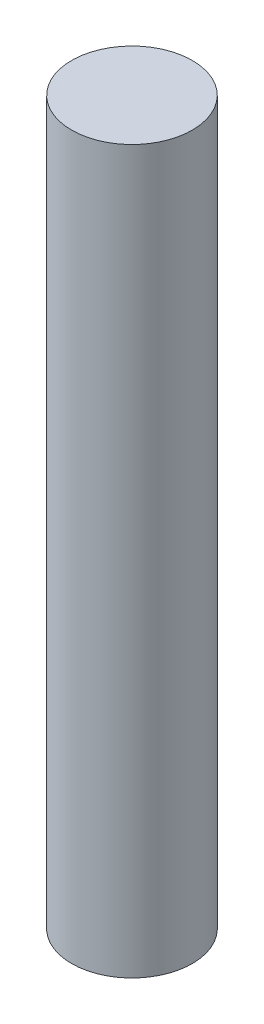
ISO-10303-21;
HEADER;
FILE_DESCRIPTION(('STEP AP214'),'2;1');
FILE_NAME('part.step','',(''),(''),'','','');
FILE_SCHEMA(('AUTOMOTIVE_DESIGN { 1 0 10303 214 1 1 1 1 }'));
ENDSEC;
DATA;
#1=APPLICATION_CONTEXT('core data for automotive mechanical design processes');
#2=APPLICATION_PROTOCOL_DEFINITION('international standard','automotive_design',2000,#1);
#3=PRODUCT_CONTEXT('',#1,'mechanical');
#4=PRODUCT('Part','Part','',(#3));
#5=PRODUCT_RELATED_PRODUCT_CATEGORY('part','',(#4));
#6=PRODUCT_DEFINITION_FORMATION('','',#4);
#7=PRODUCT_DEFINITION_CONTEXT('part definition',#1,'design');
#8=PRODUCT_DEFINITION('design','',#6,#7);
#9=PRODUCT_DEFINITION_SHAPE('','',#8);
#10=(LENGTH_UNIT() NAMED_UNIT(*) SI_UNIT(.MILLI.,.METRE.));
#11=(NAMED_UNIT(*) PLANE_ANGLE_UNIT() SI_UNIT($,.RADIAN.));
#12=(NAMED_UNIT(*) SI_UNIT($,.STERADIAN.) SOLID_ANGLE_UNIT());
#13=UNCERTAINTY_MEASURE_WITH_UNIT(LENGTH_MEASURE(1.E-05),#10,'distance_accuracy_value','');
#14=(GEOMETRIC_REPRESENTATION_CONTEXT(3) GLOBAL_UNCERTAINTY_ASSIGNED_CONTEXT((#13)) GLOBAL_UNIT_ASSIGNED_CONTEXT((#10,
#11,#12)) REPRESENTATION_CONTEXT('',''));
#15=CARTESIAN_POINT('',(0.,0.,0.));
#16=DIRECTION('',(0.,0.,1.));
#17=DIRECTION('',(1.,0.,0.));
#18=AXIS2_PLACEMENT_3D('',#15,#16,#17);
#19=CARTESIAN_POINT('',(0.,24.7,0.));
#20=DIRECTION('',(0.,-1.,0.));
#21=DIRECTION('',(0.,0.,-1.));
#22=AXIS2_PLACEMENT_3D('',#19,#20,#21);
#23=CYLINDRICAL_SURFACE('',#22,2.065);
#24=CARTESIAN_POINT('',(0.,24.7,0.));
#25=DIRECTION('',(0.,1.,0.));
#26=DIRECTION('',(0.,0.,1.));
#27=AXIS2_PLACEMENT_3D('',#24,#25,#26);
#28=CIRCLE('',#27,2.065);
#29=CARTESIAN_POINT('',(0.,24.7,2.065));
#30=VERTEX_POINT('',#29);
#31=EDGE_CURVE('E10',#30,#30,#28,.T.);
#32=ORIENTED_EDGE('',*,*,#31,.F.);
#33=EDGE_LOOP('',(#32));
#34=FACE_BOUND('',#33,.T.);
#35=CARTESIAN_POINT('',(0.,0.,0.));
#36=DIRECTION('',(0.,1.,0.));
#37=DIRECTION('',(0.,0.,1.));
#38=AXIS2_PLACEMENT_3D('',#35,#36,#37);
#39=CIRCLE('',#38,2.065);
#40=CARTESIAN_POINT('',(0.,0.,2.065));
#41=VERTEX_POINT('',#40);
#42=EDGE_CURVE('E37',#41,#41,#39,.T.);
#43=ORIENTED_EDGE('',*,*,#42,.T.);
#44=EDGE_LOOP('',(#43));
#45=FACE_BOUND('',#44,.T.);
#46=ADVANCED_FACE('F34',(#34,#45),#23,.T.);
#47=CARTESIAN_POINT('',(0.,24.7,0.));
#48=DIRECTION('',(0.,1.,0.));
#49=DIRECTION('',(0.,0.,1.));
#50=AXIS2_PLACEMENT_3D('',#47,#48,#49);
#51=PLANE('',#50);
#52=ORIENTED_EDGE('',*,*,#31,.T.);
#53=EDGE_LOOP('',(#52));
#54=FACE_BOUND('',#53,.T.);
#55=ADVANCED_FACE('F49',(#54),#51,.T.);
#56=CARTESIAN_POINT('',(0.,0.,0.));
#57=DIRECTION('',(0.,1.,0.));
#58=DIRECTION('',(0.,0.,1.));
#59=AXIS2_PLACEMENT_3D('',#56,#57,#58);
#60=PLANE('',#59);
#61=ORIENTED_EDGE('',*,*,#42,.F.);
#62=EDGE_LOOP('',(#61));
#63=FACE_BOUND('',#62,.T.);
#64=ADVANCED_FACE('F47',(#63),#60,.F.);
#65=CLOSED_SHELL('',(#46,#55,#64));
#66=MANIFOLD_SOLID_BREP('B2',#65);
#67=ADVANCED_BREP_SHAPE_REPRESENTATION('',(#18,#66),#14);
#68=SHAPE_DEFINITION_REPRESENTATION(#9,#67);
ENDSEC;
END-ISO-10303-21;
